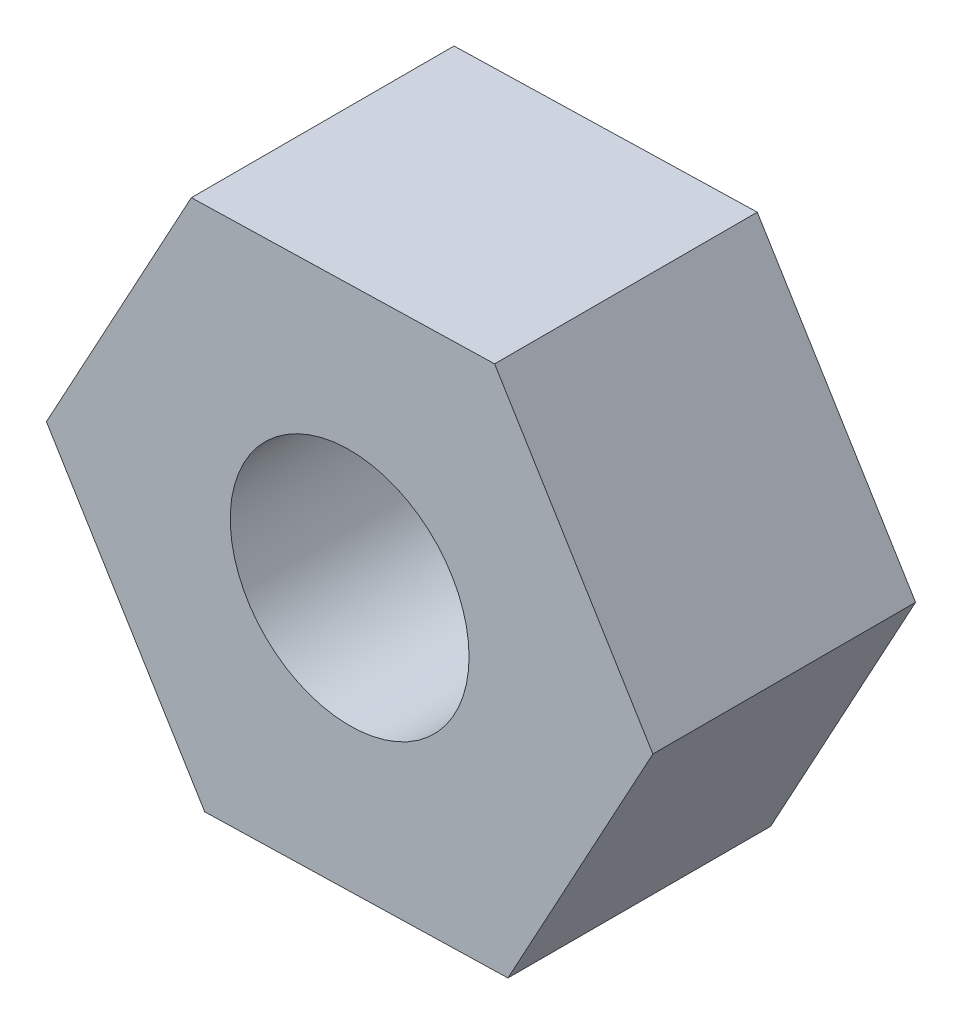
ISO-10303-21;
HEADER;
FILE_DESCRIPTION(('STEP AP214'),'2;1');
FILE_NAME('part.step','',(''),(''),'','','');
FILE_SCHEMA(('AUTOMOTIVE_DESIGN { 1 0 10303 214 1 1 1 1 }'));
ENDSEC;
DATA;
#1=APPLICATION_CONTEXT('core data for automotive mechanical design processes');
#2=APPLICATION_PROTOCOL_DEFINITION('international standard','automotive_design',2000,#1);
#3=PRODUCT_CONTEXT('',#1,'mechanical');
#4=PRODUCT('Part','Part','',(#3));
#5=PRODUCT_RELATED_PRODUCT_CATEGORY('part','',(#4));
#6=PRODUCT_DEFINITION_FORMATION('','',#4);
#7=PRODUCT_DEFINITION_CONTEXT('part definition',#1,'design');
#8=PRODUCT_DEFINITION('design','',#6,#7);
#9=PRODUCT_DEFINITION_SHAPE('','',#8);
#10=(LENGTH_UNIT() NAMED_UNIT(*) SI_UNIT(.MILLI.,.METRE.));
#11=(NAMED_UNIT(*) PLANE_ANGLE_UNIT() SI_UNIT($,.RADIAN.));
#12=(NAMED_UNIT(*) SI_UNIT($,.STERADIAN.) SOLID_ANGLE_UNIT());
#13=UNCERTAINTY_MEASURE_WITH_UNIT(LENGTH_MEASURE(1.E-05),#10,'distance_accuracy_value','');
#14=(GEOMETRIC_REPRESENTATION_CONTEXT(3) GLOBAL_UNCERTAINTY_ASSIGNED_CONTEXT((#13)) GLOBAL_UNIT_ASSIGNED_CONTEXT((#10,
#11,#12)) REPRESENTATION_CONTEXT('',''));
#15=CARTESIAN_POINT('',(0.,0.,0.));
#16=DIRECTION('',(0.,0.,1.));
#17=DIRECTION('',(1.,0.,0.));
#18=AXIS2_PLACEMENT_3D('',#15,#16,#17);
#19=CARTESIAN_POINT('',(0.,0.,5.5));
#20=DIRECTION('',(0.,0.,1.));
#21=DIRECTION('',(1.,0.,0.));
#22=AXIS2_PLACEMENT_3D('',#19,#20,#21);
#23=PLANE('',#22);
#24=DIRECTION('',(0.999676767416266,0.0254236246071341,0.));
#25=VECTOR('',#24,1.);
#26=CARTESIAN_POINT('',(-3.03457014389794,-5.57895307159834,5.5));
#27=LINE('',#26,#25);
#28=CARTESIAN_POINT('',(-3.03457014389794,-5.57895307159834,5.5));
#29=VERTEX_POINT('',#28);
#30=CARTESIAN_POINT('',(3.31423001457642,-5.41749136998059,5.5));
#31=VERTEX_POINT('',#30);
#32=EDGE_CURVE('E130',#29,#31,#27,.T.);
#33=ORIENTED_EDGE('',*,*,#32,.T.);
#34=DIRECTION('',(0.477820878942075,0.878457288459162,0.));
#35=VECTOR('',#34,1.);
#36=CARTESIAN_POINT('',(3.31423001457642,-5.41749136998059,5.5));
#37=LINE('',#36,#35);
#38=CARTESIAN_POINT('',(6.34880015847436,0.161461701617756,5.5));
#39=VERTEX_POINT('',#38);
#40=EDGE_CURVE('E88',#31,#39,#37,.T.);
#41=ORIENTED_EDGE('',*,*,#40,.T.);
#42=DIRECTION('',(-0.52185588847419,0.853033663852027,0.));
#43=VECTOR('',#42,1.);
#44=CARTESIAN_POINT('',(6.34880015847436,0.161461701617756,5.5));
#45=LINE('',#44,#43);
#46=CARTESIAN_POINT('',(3.03457014389794,5.57895307159834,5.5));
#47=VERTEX_POINT('',#46);
#48=EDGE_CURVE('E101',#39,#47,#45,.T.);
#49=ORIENTED_EDGE('',*,*,#48,.T.);
#50=DIRECTION('',(-0.999676767416266,-0.0254236246071345,0.));
#51=VECTOR('',#50,1.);
#52=CARTESIAN_POINT('',(3.03457014389794,5.57895307159834,5.5));
#53=LINE('',#52,#51);
#54=CARTESIAN_POINT('',(-3.31423001457642,5.41749136998058,5.5));
#55=VERTEX_POINT('',#54);
#56=EDGE_CURVE('E95',#47,#55,#53,.T.);
#57=ORIENTED_EDGE('',*,*,#56,.T.);
#58=DIRECTION('',(-0.477820878942076,-0.878457288459161,0.));
#59=VECTOR('',#58,1.);
#60=CARTESIAN_POINT('',(-3.31423001457642,5.41749136998058,5.5));
#61=LINE('',#60,#59);
#62=CARTESIAN_POINT('',(-6.34880015847436,-0.161461701617753,5.5));
#63=VERTEX_POINT('',#62);
#64=EDGE_CURVE('E99',#55,#63,#61,.T.);
#65=ORIENTED_EDGE('',*,*,#64,.T.);
#66=DIRECTION('',(0.52185588847419,-0.853033663852027,0.));
#67=VECTOR('',#66,1.);
#68=CARTESIAN_POINT('',(-6.34880015847436,-0.161461701617753,5.5));
#69=LINE('',#68,#67);
#70=EDGE_CURVE('E51',#63,#29,#69,.T.);
#71=ORIENTED_EDGE('',*,*,#70,.T.);
#72=EDGE_LOOP('',(#33,#41,#49,#57,#65,#71));
#73=FACE_BOUND('',#72,.T.);
#74=CARTESIAN_POINT('',(0.,0.,5.5));
#75=DIRECTION('',(0.,0.,1.));
#76=DIRECTION('',(1.,0.,0.));
#77=AXIS2_PLACEMENT_3D('',#74,#75,#76);
#78=CIRCLE('',#77,2.5);
#79=CARTESIAN_POINT('',(2.5,0.,5.5));
#80=VERTEX_POINT('',#79);
#81=EDGE_CURVE('E123',#80,#80,#78,.T.);
#82=ORIENTED_EDGE('',*,*,#81,.F.);
#83=EDGE_LOOP('',(#82));
#84=FACE_BOUND('',#83,.T.);
#85=ADVANCED_FACE('F34',(#73,#84),#23,.T.);
#86=CARTESIAN_POINT('',(0.,0.,0.));
#87=DIRECTION('',(0.,0.,1.));
#88=DIRECTION('',(1.,0.,0.));
#89=AXIS2_PLACEMENT_3D('',#86,#87,#88);
#90=PLANE('',#89);
#91=DIRECTION('',(0.999676767416266,0.0254236246071341,0.));
#92=VECTOR('',#91,1.);
#93=CARTESIAN_POINT('',(-3.03457014389794,-5.57895307159834,0.));
#94=LINE('',#93,#92);
#95=CARTESIAN_POINT('',(-3.03457014389794,-5.57895307159834,0.));
#96=VERTEX_POINT('',#95);
#97=CARTESIAN_POINT('',(3.31423001457642,-5.41749136998059,0.));
#98=VERTEX_POINT('',#97);
#99=EDGE_CURVE('E119',#96,#98,#94,.T.);
#100=ORIENTED_EDGE('',*,*,#99,.F.);
#101=DIRECTION('',(0.52185588847419,-0.853033663852027,0.));
#102=VECTOR('',#101,1.);
#103=CARTESIAN_POINT('',(-6.34880015847436,-0.161461701617753,0.));
#104=LINE('',#103,#102);
#105=CARTESIAN_POINT('',(-6.34880015847436,-0.161461701617753,0.));
#106=VERTEX_POINT('',#105);
#107=EDGE_CURVE('E80',#106,#96,#104,.T.);
#108=ORIENTED_EDGE('',*,*,#107,.F.);
#109=DIRECTION('',(-0.477820878942076,-0.878457288459161,0.));
#110=VECTOR('',#109,1.);
#111=CARTESIAN_POINT('',(-3.31423001457642,5.41749136998058,0.));
#112=LINE('',#111,#110);
#113=CARTESIAN_POINT('',(-3.31423001457642,5.41749136998058,0.));
#114=VERTEX_POINT('',#113);
#115=EDGE_CURVE('E74',#114,#106,#112,.T.);
#116=ORIENTED_EDGE('',*,*,#115,.F.);
#117=DIRECTION('',(-0.999676767416266,-0.0254236246071345,0.));
#118=VECTOR('',#117,1.);
#119=CARTESIAN_POINT('',(3.03457014389794,5.57895307159834,0.));
#120=LINE('',#119,#118);
#121=CARTESIAN_POINT('',(3.03457014389794,5.57895307159834,0.));
#122=VERTEX_POINT('',#121);
#123=EDGE_CURVE('E109',#122,#114,#120,.T.);
#124=ORIENTED_EDGE('',*,*,#123,.F.);
#125=DIRECTION('',(-0.52185588847419,0.853033663852027,0.));
#126=VECTOR('',#125,1.);
#127=CARTESIAN_POINT('',(6.34880015847436,0.161461701617756,0.));
#128=LINE('',#127,#126);
#129=CARTESIAN_POINT('',(6.34880015847436,0.161461701617756,0.));
#130=VERTEX_POINT('',#129);
#131=EDGE_CURVE('E125',#130,#122,#128,.T.);
#132=ORIENTED_EDGE('',*,*,#131,.F.);
#133=DIRECTION('',(0.477820878942075,0.878457288459162,0.));
#134=VECTOR('',#133,1.);
#135=CARTESIAN_POINT('',(3.31423001457642,-5.41749136998059,0.));
#136=LINE('',#135,#134);
#137=EDGE_CURVE('E122',#98,#130,#136,.T.);
#138=ORIENTED_EDGE('',*,*,#137,.F.);
#139=EDGE_LOOP('',(#100,#108,#116,#124,#132,#138));
#140=FACE_BOUND('',#139,.T.);
#141=CARTESIAN_POINT('',(0.,0.,0.));
#142=DIRECTION('',(0.,0.,1.));
#143=DIRECTION('',(1.,0.,0.));
#144=AXIS2_PLACEMENT_3D('',#141,#142,#143);
#145=CIRCLE('',#144,2.5);
#146=CARTESIAN_POINT('',(2.5,0.,0.));
#147=VERTEX_POINT('',#146);
#148=EDGE_CURVE('E223',#147,#147,#145,.T.);
#149=ORIENTED_EDGE('',*,*,#148,.T.);
#150=EDGE_LOOP('',(#149));
#151=FACE_BOUND('',#150,.T.);
#152=ADVANCED_FACE('F139',(#140,#151),#90,.F.);
#153=CARTESIAN_POINT('',(-3.03457014389794,-5.57895307159834,5.5));
#154=DIRECTION('',(-0.0254236246071341,0.999676767416266,0.));
#155=DIRECTION('',(-0.999676767416266,-0.0254236246071341,0.));
#156=AXIS2_PLACEMENT_3D('',#153,#154,#155);
#157=PLANE('',#156);
#158=ORIENTED_EDGE('',*,*,#99,.T.);
#159=DIRECTION('',(0.,0.,-1.));
#160=VECTOR('',#159,1.);
#161=CARTESIAN_POINT('',(3.31423001457642,-5.41749136998059,5.5));
#162=LINE('',#161,#160);
#163=EDGE_CURVE('E11',#31,#98,#162,.T.);
#164=ORIENTED_EDGE('',*,*,#163,.F.);
#165=ORIENTED_EDGE('',*,*,#32,.F.);
#166=DIRECTION('',(0.,0.,-1.));
#167=VECTOR('',#166,1.);
#168=CARTESIAN_POINT('',(-3.03457014389794,-5.57895307159834,5.5));
#169=LINE('',#168,#167);
#170=EDGE_CURVE('E115',#29,#96,#169,.T.);
#171=ORIENTED_EDGE('',*,*,#170,.T.);
#172=EDGE_LOOP('',(#158,#164,#165,#171));
#173=FACE_BOUND('',#172,.T.);
#174=ADVANCED_FACE('F36',(#173),#157,.F.);
#175=CARTESIAN_POINT('',(3.31423001457642,-5.41749136998059,5.5));
#176=DIRECTION('',(-0.878457288459162,0.477820878942075,0.));
#177=DIRECTION('',(-0.477820878942075,-0.878457288459162,0.));
#178=AXIS2_PLACEMENT_3D('',#175,#176,#177);
#179=PLANE('',#178);
#180=ORIENTED_EDGE('',*,*,#137,.T.);
#181=DIRECTION('',(0.,0.,-1.));
#182=VECTOR('',#181,1.);
#183=CARTESIAN_POINT('',(6.34880015847436,0.161461701617756,5.5));
#184=LINE('',#183,#182);
#185=EDGE_CURVE('E43',#39,#130,#184,.T.);
#186=ORIENTED_EDGE('',*,*,#185,.F.);
#187=ORIENTED_EDGE('',*,*,#40,.F.);
#188=ORIENTED_EDGE('',*,*,#163,.T.);
#189=EDGE_LOOP('',(#180,#186,#187,#188));
#190=FACE_BOUND('',#189,.T.);
#191=ADVANCED_FACE('F164',(#190),#179,.F.);
#192=CARTESIAN_POINT('',(6.34880015847436,0.161461701617756,5.5));
#193=DIRECTION('',(-0.853033663852027,-0.52185588847419,0.));
#194=DIRECTION('',(0.52185588847419,-0.853033663852027,0.));
#195=AXIS2_PLACEMENT_3D('',#192,#193,#194);
#196=PLANE('',#195);
#197=ORIENTED_EDGE('',*,*,#131,.T.);
#198=DIRECTION('',(0.,0.,-1.));
#199=VECTOR('',#198,1.);
#200=CARTESIAN_POINT('',(3.03457014389794,5.57895307159834,5.5));
#201=LINE('',#200,#199);
#202=EDGE_CURVE('E110',#47,#122,#201,.T.);
#203=ORIENTED_EDGE('',*,*,#202,.F.);
#204=ORIENTED_EDGE('',*,*,#48,.F.);
#205=ORIENTED_EDGE('',*,*,#185,.T.);
#206=EDGE_LOOP('',(#197,#203,#204,#205));
#207=FACE_BOUND('',#206,.T.);
#208=ADVANCED_FACE('F136',(#207),#196,.F.);
#209=CARTESIAN_POINT('',(3.03457014389794,5.57895307159834,5.5));
#210=DIRECTION('',(0.0254236246071345,-0.999676767416266,0.));
#211=DIRECTION('',(0.999676767416266,0.0254236246071345,0.));
#212=AXIS2_PLACEMENT_3D('',#209,#210,#211);
#213=PLANE('',#212);
#214=ORIENTED_EDGE('',*,*,#123,.T.);
#215=DIRECTION('',(0.,0.,-1.));
#216=VECTOR('',#215,1.);
#217=CARTESIAN_POINT('',(-3.31423001457642,5.41749136998058,5.5));
#218=LINE('',#217,#216);
#219=EDGE_CURVE('E106',#55,#114,#218,.T.);
#220=ORIENTED_EDGE('',*,*,#219,.F.);
#221=ORIENTED_EDGE('',*,*,#56,.F.);
#222=ORIENTED_EDGE('',*,*,#202,.T.);
#223=EDGE_LOOP('',(#214,#220,#221,#222));
#224=FACE_BOUND('',#223,.T.);
#225=ADVANCED_FACE('F107',(#224),#213,.F.);
#226=CARTESIAN_POINT('',(-3.31423001457642,5.41749136998058,5.5));
#227=DIRECTION('',(0.878457288459161,-0.477820878942076,0.));
#228=DIRECTION('',(0.477820878942076,0.878457288459161,0.));
#229=AXIS2_PLACEMENT_3D('',#226,#227,#228);
#230=PLANE('',#229);
#231=ORIENTED_EDGE('',*,*,#115,.T.);
#232=DIRECTION('',(0.,0.,-1.));
#233=VECTOR('',#232,1.);
#234=CARTESIAN_POINT('',(-6.34880015847436,-0.161461701617753,5.5));
#235=LINE('',#234,#233);
#236=EDGE_CURVE('E111',#63,#106,#235,.T.);
#237=ORIENTED_EDGE('',*,*,#236,.F.);
#238=ORIENTED_EDGE('',*,*,#64,.F.);
#239=ORIENTED_EDGE('',*,*,#219,.T.);
#240=EDGE_LOOP('',(#231,#237,#238,#239));
#241=FACE_BOUND('',#240,.T.);
#242=ADVANCED_FACE('F113',(#241),#230,.F.);
#243=CARTESIAN_POINT('',(-6.34880015847436,-0.161461701617753,5.5));
#244=DIRECTION('',(0.853033663852027,0.52185588847419,0.));
#245=DIRECTION('',(-0.52185588847419,0.853033663852027,0.));
#246=AXIS2_PLACEMENT_3D('',#243,#244,#245);
#247=PLANE('',#246);
#248=ORIENTED_EDGE('',*,*,#107,.T.);
#249=ORIENTED_EDGE('',*,*,#170,.F.);
#250=ORIENTED_EDGE('',*,*,#70,.F.);
#251=ORIENTED_EDGE('',*,*,#236,.T.);
#252=EDGE_LOOP('',(#248,#249,#250,#251));
#253=FACE_BOUND('',#252,.T.);
#254=ADVANCED_FACE('F144',(#253),#247,.F.);
#255=CARTESIAN_POINT('',(0.,0.,5.5));
#256=DIRECTION('',(0.,0.,-1.));
#257=DIRECTION('',(-1.,0.,0.));
#258=AXIS2_PLACEMENT_3D('',#255,#256,#257);
#259=CYLINDRICAL_SURFACE('',#258,2.5);
#260=ORIENTED_EDGE('',*,*,#81,.T.);
#261=EDGE_LOOP('',(#260));
#262=FACE_BOUND('',#261,.T.);
#263=ORIENTED_EDGE('',*,*,#148,.F.);
#264=EDGE_LOOP('',(#263));
#265=FACE_BOUND('',#264,.T.);
#266=ADVANCED_FACE('F146',(#262,#265),#259,.F.);
#267=CLOSED_SHELL('',(#85,#152,#174,#191,#208,#225,#242,#254,#266));
#268=MANIFOLD_SOLID_BREP('B2',#267);
#269=ADVANCED_BREP_SHAPE_REPRESENTATION('',(#18,#268),#14);
#270=SHAPE_DEFINITION_REPRESENTATION(#9,#269);
ENDSEC;
END-ISO-10303-21;
